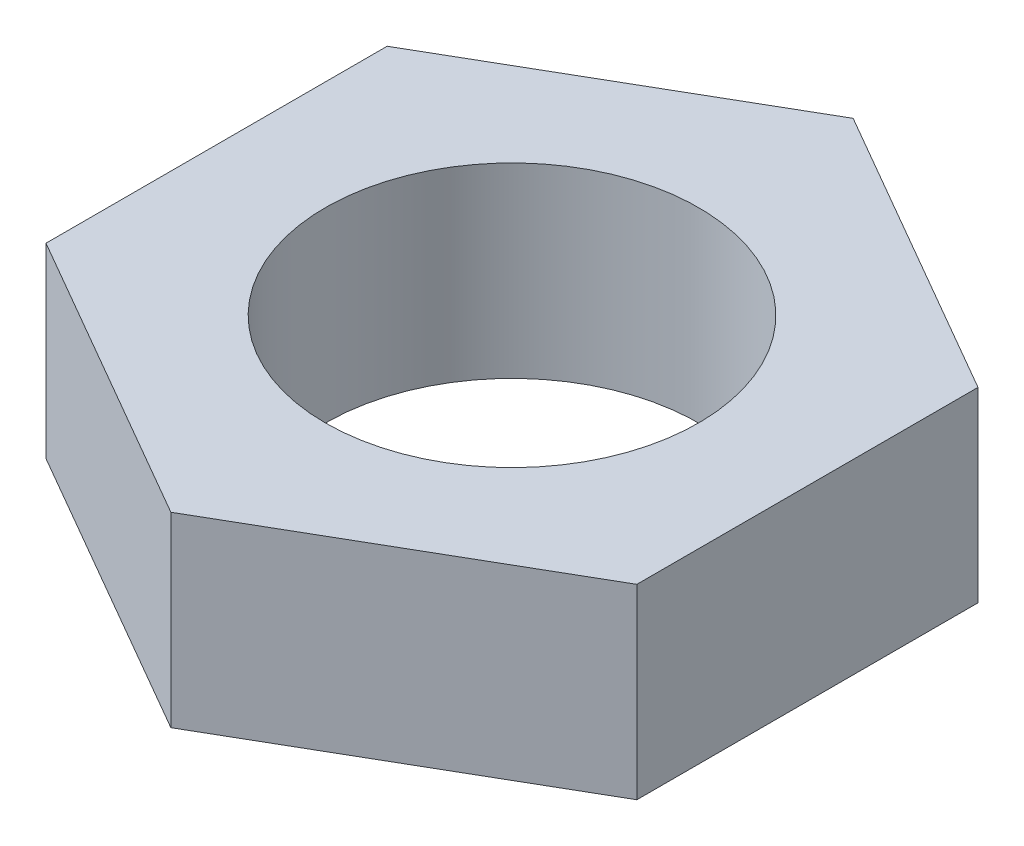
ISO-10303-21;
HEADER;
FILE_DESCRIPTION(('STEP AP214'),'2;1');
FILE_NAME('part.step','',(''),(''),'','','');
FILE_SCHEMA(('AUTOMOTIVE_DESIGN { 1 0 10303 214 1 1 1 1 }'));
ENDSEC;
DATA;
#1=APPLICATION_CONTEXT('core data for automotive mechanical design processes');
#2=APPLICATION_PROTOCOL_DEFINITION('international standard','automotive_design',2000,#1);
#3=PRODUCT_CONTEXT('',#1,'mechanical');
#4=PRODUCT('Part','Part','',(#3));
#5=PRODUCT_RELATED_PRODUCT_CATEGORY('part','',(#4));
#6=PRODUCT_DEFINITION_FORMATION('','',#4);
#7=PRODUCT_DEFINITION_CONTEXT('part definition',#1,'design');
#8=PRODUCT_DEFINITION('design','',#6,#7);
#9=PRODUCT_DEFINITION_SHAPE('','',#8);
#10=(LENGTH_UNIT() NAMED_UNIT(*) SI_UNIT(.MILLI.,.METRE.));
#11=(NAMED_UNIT(*) PLANE_ANGLE_UNIT() SI_UNIT($,.RADIAN.));
#12=(NAMED_UNIT(*) SI_UNIT($,.STERADIAN.) SOLID_ANGLE_UNIT());
#13=UNCERTAINTY_MEASURE_WITH_UNIT(LENGTH_MEASURE(1.E-05),#10,'distance_accuracy_value','');
#14=(GEOMETRIC_REPRESENTATION_CONTEXT(3) GLOBAL_UNCERTAINTY_ASSIGNED_CONTEXT((#13)) GLOBAL_UNIT_ASSIGNED_CONTEXT((#10,
#11,#12)) REPRESENTATION_CONTEXT('',''));
#15=CARTESIAN_POINT('',(0.,0.,0.));
#16=DIRECTION('',(0.,0.,1.));
#17=DIRECTION('',(1.,0.,0.));
#18=AXIS2_PLACEMENT_3D('',#15,#16,#17);
#19=CARTESIAN_POINT('',(0.,6.,0.));
#20=DIRECTION('',(0.,1.,0.));
#21=DIRECTION('',(0.,0.,1.));
#22=AXIS2_PLACEMENT_3D('',#19,#20,#21);
#23=PLANE('',#22);
#24=DIRECTION('',(-0.866025403784442,0.,-0.499999999999995));
#25=VECTOR('',#24,1.);
#26=CARTESIAN_POINT('',(9.49999999999994,6.,-5.48482755730156));
#27=LINE('',#26,#25);
#28=CARTESIAN_POINT('',(9.49999999999994,6.,-5.48482755730156));
#29=VERTEX_POINT('',#28);
#30=CARTESIAN_POINT('',(0.,6.,-10.9696551146029));
#31=VERTEX_POINT('',#30);
#32=EDGE_CURVE('E152',#29,#31,#27,.T.);
#33=ORIENTED_EDGE('',*,*,#32,.T.);
#34=DIRECTION('',(-0.866025403784438,0.,0.500000000000001));
#35=VECTOR('',#34,1.);
#36=CARTESIAN_POINT('',(0.,6.,-10.9696551146029));
#37=LINE('',#36,#35);
#38=CARTESIAN_POINT('',(-9.50000000000002,6.,-5.48482755730143));
#39=VERTEX_POINT('',#38);
#40=EDGE_CURVE('E100',#31,#39,#37,.T.);
#41=ORIENTED_EDGE('',*,*,#40,.T.);
#42=DIRECTION('',(0.,0.,1.));
#43=VECTOR('',#42,1.);
#44=CARTESIAN_POINT('',(-9.50000000000002,6.,-5.48482755730143));
#45=LINE('',#44,#43);
#46=CARTESIAN_POINT('',(-9.49999999999998,6.,5.48482755730149));
#47=VERTEX_POINT('',#46);
#48=EDGE_CURVE('E113',#39,#47,#45,.T.);
#49=ORIENTED_EDGE('',*,*,#48,.T.);
#50=DIRECTION('',(0.866025403784442,0.,0.499999999999995));
#51=VECTOR('',#50,1.);
#52=CARTESIAN_POINT('',(-9.49999999999998,6.,5.48482755730149));
#53=LINE('',#52,#51);
#54=CARTESIAN_POINT('',(0.,6.,10.9696551146029));
#55=VERTEX_POINT('',#54);
#56=EDGE_CURVE('E107',#47,#55,#53,.T.);
#57=ORIENTED_EDGE('',*,*,#56,.T.);
#58=DIRECTION('',(0.866025403784435,0.,-0.500000000000007));
#59=VECTOR('',#58,1.);
#60=CARTESIAN_POINT('',(0.,6.,10.9696551146029));
#61=LINE('',#60,#59);
#62=CARTESIAN_POINT('',(9.50000000000006,6.,5.48482755730136));
#63=VERTEX_POINT('',#62);
#64=EDGE_CURVE('E111',#55,#63,#61,.T.);
#65=ORIENTED_EDGE('',*,*,#64,.T.);
#66=DIRECTION('',(0.,0.,-1.));
#67=VECTOR('',#66,1.);
#68=CARTESIAN_POINT('',(9.50000000000006,6.,5.48482755730136));
#69=LINE('',#68,#67);
#70=EDGE_CURVE('E63',#63,#29,#69,.T.);
#71=ORIENTED_EDGE('',*,*,#70,.T.);
#72=EDGE_LOOP('',(#33,#41,#49,#57,#65,#71));
#73=FACE_BOUND('',#72,.T.);
#74=CARTESIAN_POINT('',(0.,6.,0.));
#75=DIRECTION('',(0.,1.,0.));
#76=DIRECTION('',(0.,0.,1.));
#77=AXIS2_PLACEMENT_3D('',#74,#75,#76);
#78=CIRCLE('',#77,6.);
#79=CARTESIAN_POINT('',(0.,6.,6.));
#80=VERTEX_POINT('',#79);
#81=EDGE_CURVE('E140',#80,#80,#78,.T.);
#82=ORIENTED_EDGE('',*,*,#81,.F.);
#83=EDGE_LOOP('',(#82));
#84=FACE_BOUND('',#83,.T.);
#85=ADVANCED_FACE('F45',(#73,#84),#23,.T.);
#86=CARTESIAN_POINT('',(0.,0.,0.));
#87=DIRECTION('',(0.,1.,0.));
#88=DIRECTION('',(0.,0.,1.));
#89=AXIS2_PLACEMENT_3D('',#86,#87,#88);
#90=PLANE('',#89);
#91=DIRECTION('',(-0.866025403784442,0.,-0.499999999999995));
#92=VECTOR('',#91,1.);
#93=CARTESIAN_POINT('',(9.49999999999994,0.,-5.48482755730156));
#94=LINE('',#93,#92);
#95=CARTESIAN_POINT('',(9.49999999999994,0.,-5.48482755730156));
#96=VERTEX_POINT('',#95);
#97=CARTESIAN_POINT('',(0.,0.,-10.9696551146029));
#98=VERTEX_POINT('',#97);
#99=EDGE_CURVE('E135',#96,#98,#94,.T.);
#100=ORIENTED_EDGE('',*,*,#99,.F.);
#101=DIRECTION('',(0.,0.,-1.));
#102=VECTOR('',#101,1.);
#103=CARTESIAN_POINT('',(9.50000000000006,0.,5.48482755730136));
#104=LINE('',#103,#102);
#105=CARTESIAN_POINT('',(9.50000000000006,0.,5.48482755730136));
#106=VERTEX_POINT('',#105);
#107=EDGE_CURVE('E92',#106,#96,#104,.T.);
#108=ORIENTED_EDGE('',*,*,#107,.F.);
#109=DIRECTION('',(0.866025403784435,0.,-0.500000000000007));
#110=VECTOR('',#109,1.);
#111=CARTESIAN_POINT('',(0.,0.,10.9696551146029));
#112=LINE('',#111,#110);
#113=CARTESIAN_POINT('',(0.,0.,10.9696551146029));
#114=VERTEX_POINT('',#113);
#115=EDGE_CURVE('E86',#114,#106,#112,.T.);
#116=ORIENTED_EDGE('',*,*,#115,.F.);
#117=DIRECTION('',(0.866025403784442,0.,0.499999999999995));
#118=VECTOR('',#117,1.);
#119=CARTESIAN_POINT('',(-9.49999999999998,0.,5.48482755730149));
#120=LINE('',#119,#118);
#121=CARTESIAN_POINT('',(-9.49999999999998,0.,5.48482755730149));
#122=VERTEX_POINT('',#121);
#123=EDGE_CURVE('E122',#122,#114,#120,.T.);
#124=ORIENTED_EDGE('',*,*,#123,.F.);
#125=DIRECTION('',(0.,0.,1.));
#126=VECTOR('',#125,1.);
#127=CARTESIAN_POINT('',(-9.50000000000002,0.,-5.48482755730143));
#128=LINE('',#127,#126);
#129=CARTESIAN_POINT('',(-9.50000000000002,0.,-5.48482755730143));
#130=VERTEX_POINT('',#129);
#131=EDGE_CURVE('E143',#130,#122,#128,.T.);
#132=ORIENTED_EDGE('',*,*,#131,.F.);
#133=DIRECTION('',(-0.866025403784438,0.,0.500000000000001));
#134=VECTOR('',#133,1.);
#135=CARTESIAN_POINT('',(0.,0.,-10.9696551146029));
#136=LINE('',#135,#134);
#137=EDGE_CURVE('E139',#98,#130,#136,.T.);
#138=ORIENTED_EDGE('',*,*,#137,.F.);
#139=EDGE_LOOP('',(#100,#108,#116,#124,#132,#138));
#140=FACE_BOUND('',#139,.T.);
#141=CARTESIAN_POINT('',(0.,0.,0.));
#142=DIRECTION('',(0.,1.,0.));
#143=DIRECTION('',(0.,0.,1.));
#144=AXIS2_PLACEMENT_3D('',#141,#142,#143);
#145=CIRCLE('',#144,6.);
#146=CARTESIAN_POINT('',(0.,0.,6.));
#147=VERTEX_POINT('',#146);
#148=EDGE_CURVE('E249',#147,#147,#145,.T.);
#149=ORIENTED_EDGE('',*,*,#148,.T.);
#150=EDGE_LOOP('',(#149));
#151=FACE_BOUND('',#150,.T.);
#152=ADVANCED_FACE('F165',(#140,#151),#90,.F.);
#153=CARTESIAN_POINT('',(9.49999999999994,6.,-5.48482755730156));
#154=DIRECTION('',(-0.499999999999995,0.,0.866025403784441));
#155=DIRECTION('',(0.866025403784442,0.,0.499999999999995));
#156=AXIS2_PLACEMENT_3D('',#153,#154,#155);
#157=PLANE('',#156);
#158=ORIENTED_EDGE('',*,*,#99,.T.);
#159=DIRECTION('',(0.,-1.,0.));
#160=VECTOR('',#159,1.);
#161=CARTESIAN_POINT('',(0.,6.,-10.9696551146029));
#162=LINE('',#161,#160);
#163=EDGE_CURVE('E11',#31,#98,#162,.T.);
#164=ORIENTED_EDGE('',*,*,#163,.F.);
#165=ORIENTED_EDGE('',*,*,#32,.F.);
#166=DIRECTION('',(0.,-1.,0.));
#167=VECTOR('',#166,1.);
#168=CARTESIAN_POINT('',(9.49999999999994,6.,-5.48482755730156));
#169=LINE('',#168,#167);
#170=EDGE_CURVE('E131',#29,#96,#169,.T.);
#171=ORIENTED_EDGE('',*,*,#170,.T.);
#172=EDGE_LOOP('',(#158,#164,#165,#171));
#173=FACE_BOUND('',#172,.T.);
#174=ADVANCED_FACE('F47',(#173),#157,.F.);
#175=CARTESIAN_POINT('',(0.,6.,-10.9696551146029));
#176=DIRECTION('',(0.500000000000001,0.,0.866025403784438));
#177=DIRECTION('',(0.866025403784438,0.,-0.500000000000001));
#178=AXIS2_PLACEMENT_3D('',#175,#176,#177);
#179=PLANE('',#178);
#180=ORIENTED_EDGE('',*,*,#137,.T.);
#181=DIRECTION('',(0.,-1.,0.));
#182=VECTOR('',#181,1.);
#183=CARTESIAN_POINT('',(-9.50000000000002,6.,-5.48482755730143));
#184=LINE('',#183,#182);
#185=EDGE_CURVE('E55',#39,#130,#184,.T.);
#186=ORIENTED_EDGE('',*,*,#185,.F.);
#187=ORIENTED_EDGE('',*,*,#40,.F.);
#188=ORIENTED_EDGE('',*,*,#163,.T.);
#189=EDGE_LOOP('',(#180,#186,#187,#188));
#190=FACE_BOUND('',#189,.T.);
#191=ADVANCED_FACE('F190',(#190),#179,.F.);
#192=CARTESIAN_POINT('',(-9.50000000000002,6.,-5.48482755730143));
#193=DIRECTION('',(1.,0.,0.));
#194=DIRECTION('',(0.,0.,-1.));
#195=AXIS2_PLACEMENT_3D('',#192,#193,#194);
#196=PLANE('',#195);
#197=ORIENTED_EDGE('',*,*,#131,.T.);
#198=DIRECTION('',(0.,-1.,0.));
#199=VECTOR('',#198,1.);
#200=CARTESIAN_POINT('',(-9.49999999999998,6.,5.48482755730149));
#201=LINE('',#200,#199);
#202=EDGE_CURVE('E124',#47,#122,#201,.T.);
#203=ORIENTED_EDGE('',*,*,#202,.F.);
#204=ORIENTED_EDGE('',*,*,#48,.F.);
#205=ORIENTED_EDGE('',*,*,#185,.T.);
#206=EDGE_LOOP('',(#197,#203,#204,#205));
#207=FACE_BOUND('',#206,.T.);
#208=ADVANCED_FACE('F162',(#207),#196,.F.);
#209=CARTESIAN_POINT('',(-9.49999999999998,6.,5.48482755730149));
#210=DIRECTION('',(0.499999999999995,0.,-0.866025403784441));
#211=DIRECTION('',(-0.866025403784442,0.,-0.499999999999995));
#212=AXIS2_PLACEMENT_3D('',#209,#210,#211);
#213=PLANE('',#212);
#214=ORIENTED_EDGE('',*,*,#123,.T.);
#215=DIRECTION('',(0.,-1.,0.));
#216=VECTOR('',#215,1.);
#217=CARTESIAN_POINT('',(0.,6.,10.9696551146029));
#218=LINE('',#217,#216);
#219=EDGE_CURVE('E119',#55,#114,#218,.T.);
#220=ORIENTED_EDGE('',*,*,#219,.F.);
#221=ORIENTED_EDGE('',*,*,#56,.F.);
#222=ORIENTED_EDGE('',*,*,#202,.T.);
#223=EDGE_LOOP('',(#214,#220,#221,#222));
#224=FACE_BOUND('',#223,.T.);
#225=ADVANCED_FACE('F120',(#224),#213,.F.);
#226=CARTESIAN_POINT('',(0.,6.,10.9696551146029));
#227=DIRECTION('',(-0.500000000000007,0.,-0.866025403784434));
#228=DIRECTION('',(-0.866025403784435,0.,0.500000000000007));
#229=AXIS2_PLACEMENT_3D('',#226,#227,#228);
#230=PLANE('',#229);
#231=ORIENTED_EDGE('',*,*,#115,.T.);
#232=DIRECTION('',(0.,-1.,0.));
#233=VECTOR('',#232,1.);
#234=CARTESIAN_POINT('',(9.50000000000006,6.,5.48482755730136));
#235=LINE('',#234,#233);
#236=EDGE_CURVE('E125',#63,#106,#235,.T.);
#237=ORIENTED_EDGE('',*,*,#236,.F.);
#238=ORIENTED_EDGE('',*,*,#64,.F.);
#239=ORIENTED_EDGE('',*,*,#219,.T.);
#240=EDGE_LOOP('',(#231,#237,#238,#239));
#241=FACE_BOUND('',#240,.T.);
#242=ADVANCED_FACE('F127',(#241),#230,.F.);
#243=CARTESIAN_POINT('',(9.50000000000006,6.,5.48482755730136));
#244=DIRECTION('',(-1.,0.,0.));
#245=DIRECTION('',(0.,0.,1.));
#246=AXIS2_PLACEMENT_3D('',#243,#244,#245);
#247=PLANE('',#246);
#248=ORIENTED_EDGE('',*,*,#107,.T.);
#249=ORIENTED_EDGE('',*,*,#170,.F.);
#250=ORIENTED_EDGE('',*,*,#70,.F.);
#251=ORIENTED_EDGE('',*,*,#236,.T.);
#252=EDGE_LOOP('',(#248,#249,#250,#251));
#253=FACE_BOUND('',#252,.T.);
#254=ADVANCED_FACE('F170',(#253),#247,.F.);
#255=CARTESIAN_POINT('',(0.,6.,0.));
#256=DIRECTION('',(0.,-1.,0.));
#257=DIRECTION('',(0.,0.,-1.));
#258=AXIS2_PLACEMENT_3D('',#255,#256,#257);
#259=CYLINDRICAL_SURFACE('',#258,6.);
#260=ORIENTED_EDGE('',*,*,#81,.T.);
#261=EDGE_LOOP('',(#260));
#262=FACE_BOUND('',#261,.T.);
#263=ORIENTED_EDGE('',*,*,#148,.F.);
#264=EDGE_LOOP('',(#263));
#265=FACE_BOUND('',#264,.T.);
#266=ADVANCED_FACE('F172',(#262,#265),#259,.F.);
#267=CLOSED_SHELL('',(#85,#152,#174,#191,#208,#225,#242,#254,#266));
#268=MANIFOLD_SOLID_BREP('B2',#267);
#269=ADVANCED_BREP_SHAPE_REPRESENTATION('',(#18,#268),#14);
#270=SHAPE_DEFINITION_REPRESENTATION(#9,#269);
ENDSEC;
END-ISO-10303-21;
